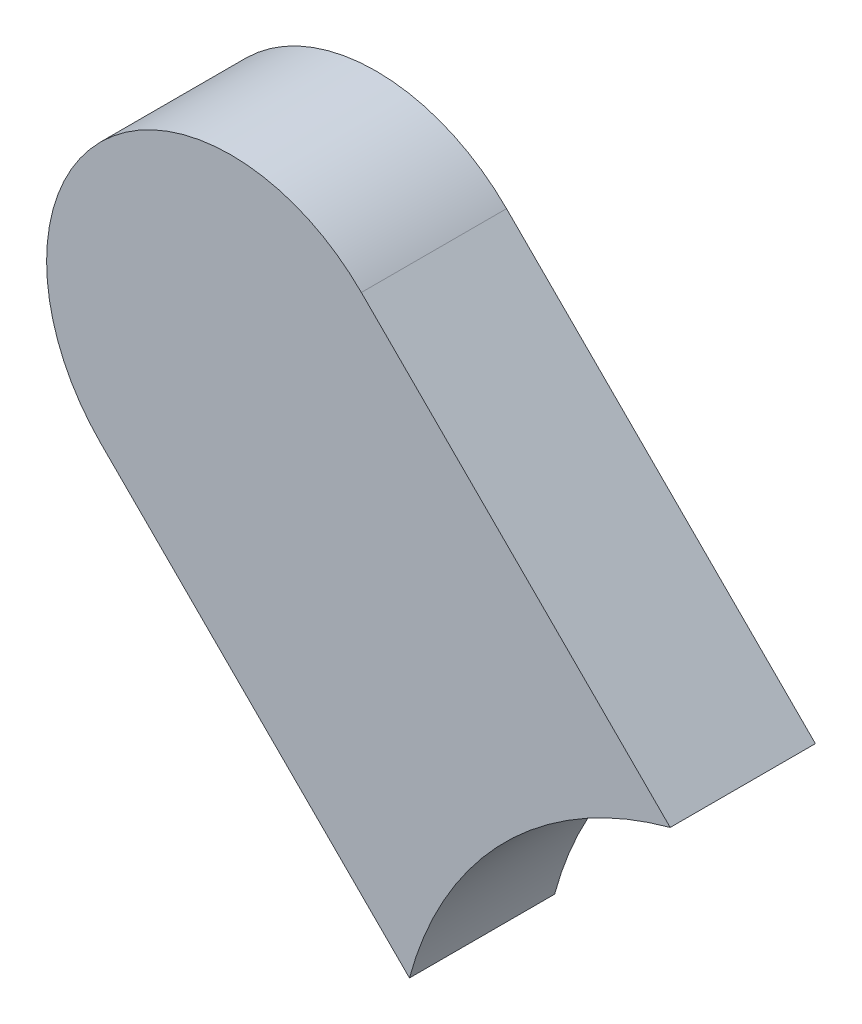
ISO-10303-21;
HEADER;
FILE_DESCRIPTION(('STEP AP214'),'2;1');
FILE_NAME('part.step','',(''),(''),'','','');
FILE_SCHEMA(('AUTOMOTIVE_DESIGN { 1 0 10303 214 1 1 1 1 }'));
ENDSEC;
DATA;
#1=APPLICATION_CONTEXT('core data for automotive mechanical design processes');
#2=APPLICATION_PROTOCOL_DEFINITION('international standard','automotive_design',2000,#1);
#3=PRODUCT_CONTEXT('',#1,'mechanical');
#4=PRODUCT('Part','Part','',(#3));
#5=PRODUCT_RELATED_PRODUCT_CATEGORY('part','',(#4));
#6=PRODUCT_DEFINITION_FORMATION('','',#4);
#7=PRODUCT_DEFINITION_CONTEXT('part definition',#1,'design');
#8=PRODUCT_DEFINITION('design','',#6,#7);
#9=PRODUCT_DEFINITION_SHAPE('','',#8);
#10=(LENGTH_UNIT() NAMED_UNIT(*) SI_UNIT(.MILLI.,.METRE.));
#11=(NAMED_UNIT(*) PLANE_ANGLE_UNIT() SI_UNIT($,.RADIAN.));
#12=(NAMED_UNIT(*) SI_UNIT($,.STERADIAN.) SOLID_ANGLE_UNIT());
#13=UNCERTAINTY_MEASURE_WITH_UNIT(LENGTH_MEASURE(1.E-05),#10,'distance_accuracy_value','');
#14=(GEOMETRIC_REPRESENTATION_CONTEXT(3) GLOBAL_UNCERTAINTY_ASSIGNED_CONTEXT((#13)) GLOBAL_UNIT_ASSIGNED_CONTEXT((#10,
#11,#12)) REPRESENTATION_CONTEXT('',''));
#15=CARTESIAN_POINT('',(0.,0.,0.));
#16=DIRECTION('',(0.,0.,1.));
#17=DIRECTION('',(1.,0.,0.));
#18=AXIS2_PLACEMENT_3D('',#15,#16,#17);
#19=CARTESIAN_POINT('',(151.86479406,113.45999406,0.));
#20=DIRECTION('',(0.707106781186541,0.707106781186554,0.));
#21=DIRECTION('',(0.707106781186554,-0.707106781186541,0.));
#22=AXIS2_PLACEMENT_3D('',#19,#20,#21);
#23=PLANE('',#22);
#24=DIRECTION('',(0.707106781186554,-0.707106781186541,0.));
#25=VECTOR('',#24,1.);
#26=CARTESIAN_POINT('',(151.86479406,113.45999406,0.1999996));
#27=LINE('',#26,#25);
#28=CARTESIAN_POINT('',(151.86479406,113.45999406,0.1999996));
#29=VERTEX_POINT('',#28);
#30=CARTESIAN_POINT('',(152.290309334697,113.034478785303,0.1999996));
#31=VERTEX_POINT('',#30);
#32=EDGE_CURVE('E11',#29,#31,#27,.T.);
#33=ORIENTED_EDGE('',*,*,#32,.F.);
#34=DIRECTION('',(0.,0.,1.));
#35=VECTOR('',#34,1.);
#36=CARTESIAN_POINT('',(151.86479406,113.45999406,0.));
#37=LINE('',#36,#35);
#38=CARTESIAN_POINT('',(151.86479406,113.45999406,0.));
#39=VERTEX_POINT('',#38);
#40=EDGE_CURVE('E24',#39,#29,#37,.T.);
#41=ORIENTED_EDGE('',*,*,#40,.F.);
#42=DIRECTION('',(0.707106781186554,-0.707106781186541,0.));
#43=VECTOR('',#42,1.);
#44=CARTESIAN_POINT('',(151.86479406,113.45999406,0.));
#45=LINE('',#44,#43);
#46=CARTESIAN_POINT('',(152.290309334697,113.034478785303,0.));
#47=VERTEX_POINT('',#46);
#48=EDGE_CURVE('E75',#39,#47,#45,.T.);
#49=ORIENTED_EDGE('',*,*,#48,.T.);
#50=DIRECTION('',(0.,0.,1.));
#51=VECTOR('',#50,1.);
#52=CARTESIAN_POINT('',(152.290309334697,113.034478785303,0.));
#53=LINE('',#52,#51);
#54=EDGE_CURVE('E37',#47,#31,#53,.T.);
#55=ORIENTED_EDGE('',*,*,#54,.T.);
#56=EDGE_LOOP('',(#33,#41,#49,#55));
#57=FACE_BOUND('',#56,.T.);
#58=ADVANCED_FACE('F17',(#57),#23,.F.);
#59=CARTESIAN_POINT('',(152.781,112.903,0.));
#60=DIRECTION('',(0.,0.,-1.));
#61=DIRECTION('',(1.,0.,0.));
#62=AXIS2_PLACEMENT_3D('',#59,#60,#61);
#63=CYLINDRICAL_SURFACE('',#62,0.508);
#64=DIRECTION('',(0.,0.,1.));
#65=VECTOR('',#64,1.);
#66=CARTESIAN_POINT('',(152.649521214697,113.393690665303,0.));
#67=LINE('',#66,#65);
#68=CARTESIAN_POINT('',(152.649521214697,113.393690665303,0.));
#69=VERTEX_POINT('',#68);
#70=CARTESIAN_POINT('',(152.649521214697,113.393690665303,0.1999996));
#71=VERTEX_POINT('',#70);
#72=EDGE_CURVE('E67',#69,#71,#67,.T.);
#73=ORIENTED_EDGE('',*,*,#72,.T.);
#74=CARTESIAN_POINT('',(152.781,112.903,0.1999996));
#75=DIRECTION('',(0.,0.,1.));
#76=DIRECTION('',(1.,0.,0.));
#77=AXIS2_PLACEMENT_3D('',#74,#75,#76);
#78=CIRCLE('',#77,0.508);
#79=EDGE_CURVE('E82',#71,#31,#78,.T.);
#80=ORIENTED_EDGE('',*,*,#79,.T.);
#81=ORIENTED_EDGE('',*,*,#54,.F.);
#82=CARTESIAN_POINT('',(152.781,112.903,0.));
#83=DIRECTION('',(0.,0.,1.));
#84=DIRECTION('',(1.,0.,0.));
#85=AXIS2_PLACEMENT_3D('',#82,#83,#84);
#86=CIRCLE('',#85,0.508);
#87=EDGE_CURVE('E80',#69,#47,#86,.T.);
#88=ORIENTED_EDGE('',*,*,#87,.F.);
#89=EDGE_LOOP('',(#73,#80,#81,#88));
#90=FACE_BOUND('',#89,.T.);
#91=ADVANCED_FACE('F88',(#90),#63,.F.);
#92=CARTESIAN_POINT('',(152.649521214697,113.393690665303,0.));
#93=DIRECTION('',(-0.707106781186541,-0.707106781186554,0.));
#94=DIRECTION('',(-0.707106781186554,0.707106781186541,0.));
#95=AXIS2_PLACEMENT_3D('',#92,#93,#94);
#96=PLANE('',#95);
#97=DIRECTION('',(-0.707106781186554,0.707106781186541,0.));
#98=VECTOR('',#97,1.);
#99=CARTESIAN_POINT('',(152.96060594,113.08260594,0.1999996));
#100=LINE('',#99,#98);
#101=CARTESIAN_POINT('',(152.22400594,113.81920594,0.1999996));
#102=VERTEX_POINT('',#101);
#103=EDGE_CURVE('E71',#71,#102,#100,.T.);
#104=ORIENTED_EDGE('',*,*,#103,.F.);
#105=ORIENTED_EDGE('',*,*,#72,.F.);
#106=DIRECTION('',(-0.707106781186554,0.707106781186541,0.));
#107=VECTOR('',#106,1.);
#108=CARTESIAN_POINT('',(152.96060594,113.08260594,0.));
#109=LINE('',#108,#107);
#110=CARTESIAN_POINT('',(152.22400594,113.81920594,0.));
#111=VERTEX_POINT('',#110);
#112=EDGE_CURVE('E63',#69,#111,#109,.T.);
#113=ORIENTED_EDGE('',*,*,#112,.T.);
#114=DIRECTION('',(0.,0.,1.));
#115=VECTOR('',#114,1.);
#116=CARTESIAN_POINT('',(152.22400594,113.81920594,0.));
#117=LINE('',#116,#115);
#118=EDGE_CURVE('E53',#111,#102,#117,.T.);
#119=ORIENTED_EDGE('',*,*,#118,.T.);
#120=EDGE_LOOP('',(#104,#105,#113,#119));
#121=FACE_BOUND('',#120,.T.);
#122=ADVANCED_FACE('F66',(#121),#96,.F.);
#123=CARTESIAN_POINT('',(152.0444,113.6396,0.));
#124=DIRECTION('',(0.,0.,-1.));
#125=DIRECTION('',(0.70710678118652,0.707106781186576,0.));
#126=AXIS2_PLACEMENT_3D('',#123,#124,#125);
#127=CYLINDRICAL_SURFACE('',#126,0.254001156230774);
#128=CARTESIAN_POINT('',(152.0444,113.6396,0.1999996));
#129=DIRECTION('',(0.,0.,1.));
#130=DIRECTION('',(0.70710678118652,0.707106781186576,0.));
#131=AXIS2_PLACEMENT_3D('',#128,#129,#130);
#132=CIRCLE('',#131,0.254001156230774);
#133=EDGE_CURVE('E59',#102,#29,#132,.T.);
#134=ORIENTED_EDGE('',*,*,#133,.F.);
#135=ORIENTED_EDGE('',*,*,#118,.F.);
#136=CARTESIAN_POINT('',(152.0444,113.6396,0.));
#137=DIRECTION('',(0.,0.,1.));
#138=DIRECTION('',(0.70710678118652,0.707106781186576,0.));
#139=AXIS2_PLACEMENT_3D('',#136,#137,#138);
#140=CIRCLE('',#139,0.254001156230774);
#141=EDGE_CURVE('E57',#111,#39,#140,.T.);
#142=ORIENTED_EDGE('',*,*,#141,.T.);
#143=ORIENTED_EDGE('',*,*,#40,.T.);
#144=EDGE_LOOP('',(#134,#135,#142,#143));
#145=FACE_BOUND('',#144,.T.);
#146=ADVANCED_FACE('F55',(#145),#127,.T.);
#147=CARTESIAN_POINT('',(151.86479406,113.45999406,0.));
#148=DIRECTION('',(0.,0.,-1.));
#149=DIRECTION('',(-1.,0.,0.));
#150=AXIS2_PLACEMENT_3D('',#147,#148,#149);
#151=PLANE('',#150);
#152=ORIENTED_EDGE('',*,*,#48,.F.);
#153=ORIENTED_EDGE('',*,*,#141,.F.);
#154=ORIENTED_EDGE('',*,*,#112,.F.);
#155=ORIENTED_EDGE('',*,*,#87,.T.);
#156=EDGE_LOOP('',(#152,#153,#154,#155));
#157=FACE_BOUND('',#156,.T.);
#158=ADVANCED_FACE('F74',(#157),#151,.T.);
#159=CARTESIAN_POINT('',(151.86479406,113.45999406,0.1999996));
#160=DIRECTION('',(0.,0.,-1.));
#161=DIRECTION('',(-1.,0.,0.));
#162=AXIS2_PLACEMENT_3D('',#159,#160,#161);
#163=PLANE('',#162);
#164=ORIENTED_EDGE('',*,*,#133,.T.);
#165=ORIENTED_EDGE('',*,*,#32,.T.);
#166=ORIENTED_EDGE('',*,*,#79,.F.);
#167=ORIENTED_EDGE('',*,*,#103,.T.);
#168=EDGE_LOOP('',(#164,#165,#166,#167));
#169=FACE_BOUND('',#168,.T.);
#170=ADVANCED_FACE('F91',(#169),#163,.F.);
#171=CLOSED_SHELL('',(#58,#91,#122,#146,#158,#170));
#172=MANIFOLD_SOLID_BREP('B1',#171);
#173=ADVANCED_BREP_SHAPE_REPRESENTATION('',(#18,#172),#14);
#174=SHAPE_DEFINITION_REPRESENTATION(#9,#173);
ENDSEC;
END-ISO-10303-21;
